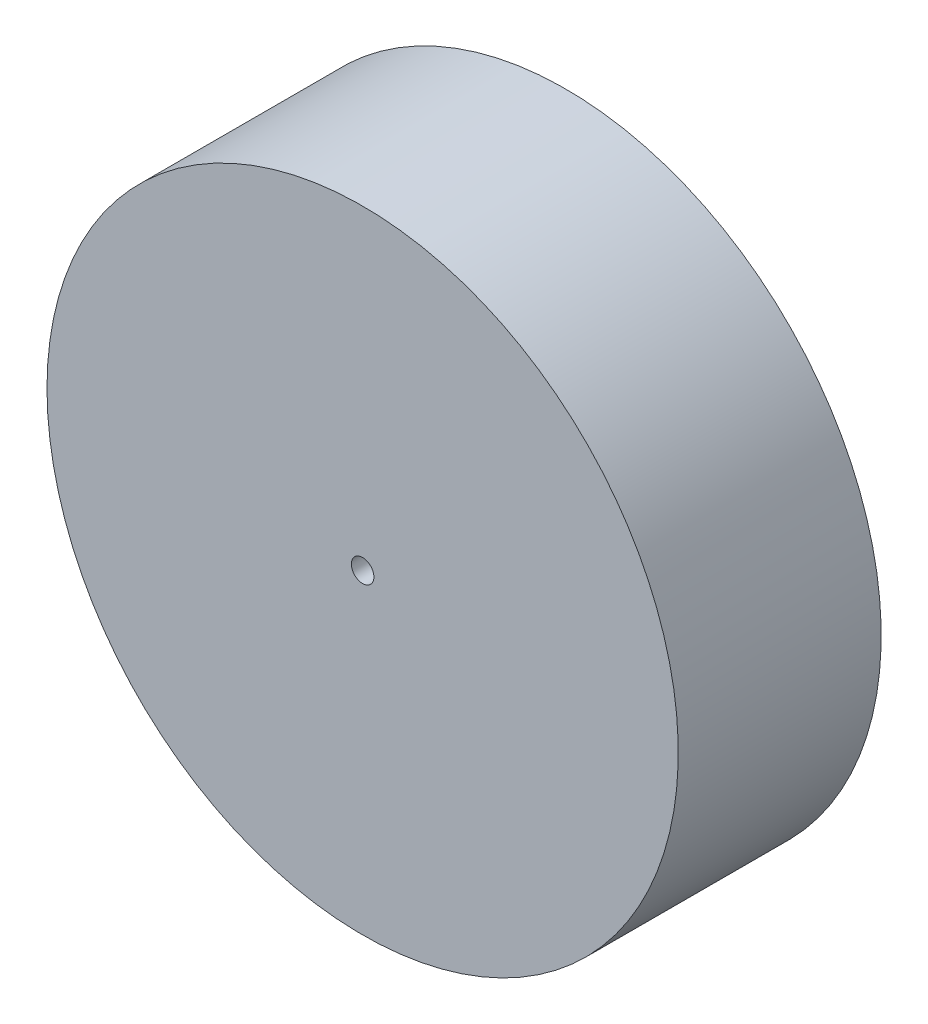
ISO-10303-21;
HEADER;
FILE_DESCRIPTION(('STEP AP214'),'2;1');
FILE_NAME('part.step','',(''),(''),'','','');
FILE_SCHEMA(('AUTOMOTIVE_DESIGN { 1 0 10303 214 1 1 1 1 }'));
ENDSEC;
DATA;
#1=APPLICATION_CONTEXT('core data for automotive mechanical design processes');
#2=APPLICATION_PROTOCOL_DEFINITION('international standard','automotive_design',2000,#1);
#3=PRODUCT_CONTEXT('',#1,'mechanical');
#4=PRODUCT('Part','Part','',(#3));
#5=PRODUCT_RELATED_PRODUCT_CATEGORY('part','',(#4));
#6=PRODUCT_DEFINITION_FORMATION('','',#4);
#7=PRODUCT_DEFINITION_CONTEXT('part definition',#1,'design');
#8=PRODUCT_DEFINITION('design','',#6,#7);
#9=PRODUCT_DEFINITION_SHAPE('','',#8);
#10=(LENGTH_UNIT() NAMED_UNIT(*) SI_UNIT(.MILLI.,.METRE.));
#11=(NAMED_UNIT(*) PLANE_ANGLE_UNIT() SI_UNIT($,.RADIAN.));
#12=(NAMED_UNIT(*) SI_UNIT($,.STERADIAN.) SOLID_ANGLE_UNIT());
#13=UNCERTAINTY_MEASURE_WITH_UNIT(LENGTH_MEASURE(1.E-05),#10,'distance_accuracy_value','');
#14=(GEOMETRIC_REPRESENTATION_CONTEXT(3) GLOBAL_UNCERTAINTY_ASSIGNED_CONTEXT((#13)) GLOBAL_UNIT_ASSIGNED_CONTEXT((#10,
#11,#12)) REPRESENTATION_CONTEXT('',''));
#15=CARTESIAN_POINT('',(0.,0.,0.));
#16=DIRECTION('',(0.,0.,1.));
#17=DIRECTION('',(1.,0.,0.));
#18=AXIS2_PLACEMENT_3D('',#15,#16,#17);
#19=CARTESIAN_POINT('',(0.,0.,45.));
#20=DIRECTION('',(0.,0.,-1.));
#21=DIRECTION('',(-1.,0.,0.));
#22=AXIS2_PLACEMENT_3D('',#19,#20,#21);
#23=CYLINDRICAL_SURFACE('',#22,70.);
#24=CARTESIAN_POINT('',(0.,0.,45.));
#25=DIRECTION('',(0.,0.,1.));
#26=DIRECTION('',(1.,0.,0.));
#27=AXIS2_PLACEMENT_3D('',#24,#25,#26);
#28=CIRCLE('',#27,70.);
#29=CARTESIAN_POINT('',(-70.,0.,45.));
#30=VERTEX_POINT('',#29);
#31=EDGE_CURVE('E10',#30,#30,#28,.T.);
#32=CARTESIAN_POINT('',(0.,0.,0.));
#33=DIRECTION('',(0.,0.,1.));
#34=DIRECTION('',(1.,0.,0.));
#35=AXIS2_PLACEMENT_3D('',#32,#33,#34);
#36=CIRCLE('',#35,70.);
#37=CARTESIAN_POINT('',(-70.,0.,0.));
#38=VERTEX_POINT('',#37);
#39=EDGE_CURVE('E44',#38,#38,#36,.T.);
#40=CARTESIAN_POINT('',(-70.,0.,45.));
#41=CARTESIAN_POINT('',(-70.,0.,44.53125));
#42=CARTESIAN_POINT('',(-70.,0.,44.0625));
#43=CARTESIAN_POINT('',(-70.,0.,43.125));
#44=CARTESIAN_POINT('',(-70.,0.,42.65625));
#45=CARTESIAN_POINT('',(-70.,0.,41.71875));
#46=CARTESIAN_POINT('',(-70.,0.,41.25));
#47=CARTESIAN_POINT('',(-70.,0.,40.3125));
#48=CARTESIAN_POINT('',(-70.,0.,39.84375));
#49=CARTESIAN_POINT('',(-70.,0.,38.90625));
#50=CARTESIAN_POINT('',(-70.,0.,38.4375));
#51=CARTESIAN_POINT('',(-70.,0.,37.5));
#52=CARTESIAN_POINT('',(-70.,0.,37.03125));
#53=CARTESIAN_POINT('',(-70.,0.,36.09375));
#54=CARTESIAN_POINT('',(-70.,0.,35.625));
#55=CARTESIAN_POINT('',(-70.,0.,34.6875));
#56=CARTESIAN_POINT('',(-70.,0.,34.21875));
#57=CARTESIAN_POINT('',(-70.,0.,33.28125));
#58=CARTESIAN_POINT('',(-70.,0.,32.8125));
#59=CARTESIAN_POINT('',(-70.,0.,31.875));
#60=CARTESIAN_POINT('',(-70.,0.,31.40625));
#61=CARTESIAN_POINT('',(-70.,0.,30.46875));
#62=CARTESIAN_POINT('',(-70.,0.,30.));
#63=CARTESIAN_POINT('',(-70.,0.,29.0625));
#64=CARTESIAN_POINT('',(-70.,0.,28.59375));
#65=CARTESIAN_POINT('',(-70.,0.,27.65625));
#66=CARTESIAN_POINT('',(-70.,0.,27.1875));
#67=CARTESIAN_POINT('',(-70.,0.,26.25));
#68=CARTESIAN_POINT('',(-70.,0.,25.78125));
#69=CARTESIAN_POINT('',(-70.,0.,24.84375));
#70=CARTESIAN_POINT('',(-70.,0.,24.375));
#71=CARTESIAN_POINT('',(-70.,0.,23.4375));
#72=CARTESIAN_POINT('',(-70.,0.,22.96875));
#73=CARTESIAN_POINT('',(-70.,0.,22.03125));
#74=CARTESIAN_POINT('',(-70.,0.,21.5625));
#75=CARTESIAN_POINT('',(-70.,0.,20.625));
#76=CARTESIAN_POINT('',(-70.,0.,20.15625));
#77=CARTESIAN_POINT('',(-70.,0.,19.21875));
#78=CARTESIAN_POINT('',(-70.,0.,18.75));
#79=CARTESIAN_POINT('',(-70.,0.,17.8125));
#80=CARTESIAN_POINT('',(-70.,0.,17.34375));
#81=CARTESIAN_POINT('',(-70.,0.,16.40625));
#82=CARTESIAN_POINT('',(-70.,0.,15.9375));
#83=CARTESIAN_POINT('',(-70.,0.,15.));
#84=CARTESIAN_POINT('',(-70.,0.,14.53125));
#85=CARTESIAN_POINT('',(-70.,0.,13.59375));
#86=CARTESIAN_POINT('',(-70.,0.,13.125));
#87=CARTESIAN_POINT('',(-70.,0.,12.1875));
#88=CARTESIAN_POINT('',(-70.,0.,11.71875));
#89=CARTESIAN_POINT('',(-70.,0.,10.78125));
#90=CARTESIAN_POINT('',(-70.,0.,10.3125));
#91=CARTESIAN_POINT('',(-70.,0.,9.37499999999999));
#92=CARTESIAN_POINT('',(-70.,0.,8.90624999999999));
#93=CARTESIAN_POINT('',(-70.,0.,7.96874999999999));
#94=CARTESIAN_POINT('',(-70.,0.,7.5));
#95=CARTESIAN_POINT('',(-70.,0.,6.56249999999999));
#96=CARTESIAN_POINT('',(-70.,0.,6.09374999999999));
#97=CARTESIAN_POINT('',(-70.,0.,5.15624999999999));
#98=CARTESIAN_POINT('',(-70.,0.,4.68749999999999));
#99=CARTESIAN_POINT('',(-70.,0.,3.74999999999999));
#100=CARTESIAN_POINT('',(-70.,0.,3.28124999999999));
#101=CARTESIAN_POINT('',(-70.,0.,2.34374999999999));
#102=CARTESIAN_POINT('',(-70.,0.,1.87499999999999));
#103=CARTESIAN_POINT('',(-70.,0.,0.937499999999992));
#104=CARTESIAN_POINT('',(-70.,0.,0.468749999999993));
#105=CARTESIAN_POINT('',(-70.,0.,0.));
#106=B_SPLINE_CURVE_WITH_KNOTS('',3,(#40,#41,#42,#43,#44,#45,#46,#47,#48,#49,#50,#51,#52,#53,
#54,#55,#56,#57,#58,#59,#60,#61,#62,#63,#64,#65,#66,#67,#68,#69,#70,#71,#72,#73,#74,#75,#76,#77,
#78,#79,#80,#81,#82,#83,#84,#85,#86,#87,#88,#89,#90,#91,#92,#93,#94,#95,#96,#97,#98,#99,#100,
#101,#102,#103,#104,#105),.UNSPECIFIED.,.F.,.F.,(4,2,2,2,2,2,2,2,2,2,2,2,2,2,2,2,2,2,2,2,2,2,2,
2,2,2,2,2,2,2,2,2,4),(0.,1.40625,2.8125,4.21874999999999,5.625,7.03125,8.43749999999999,9.84375,
11.25,12.65625,14.0625,15.46875,16.875,18.28125,19.6875,21.09375,22.5,23.90625,25.3125,26.71875,
28.125,29.53125,30.9375,32.34375,33.75,35.15625,36.5625,37.96875,39.375,40.78125,42.1875,
43.59375,45.),.UNSPECIFIED.);
#107=EDGE_CURVE('BSEAM41',#30,#38,#106,.T.);
#108=ORIENTED_EDGE('',*,*,#31,.F.);
#109=ORIENTED_EDGE('',*,*,#39,.T.);
#110=ORIENTED_EDGE('',*,*,#107,.T.);
#111=ORIENTED_EDGE('',*,*,#107,.F.);
#112=EDGE_LOOP('',(#108,#110,#109,#111));
#113=FACE_BOUND('',#112,.T.);
#114=ADVANCED_FACE('F41',(#113),#23,.T.);
#115=CARTESIAN_POINT('',(0.,0.,45.));
#116=DIRECTION('',(0.,0.,1.));
#117=DIRECTION('',(1.,0.,0.));
#118=AXIS2_PLACEMENT_3D('',#115,#116,#117);
#119=PLANE('',#118);
#120=CARTESIAN_POINT('',(0.,0.,45.));
#121=DIRECTION('',(0.,0.,1.));
#122=DIRECTION('',(1.,0.,0.));
#123=AXIS2_PLACEMENT_3D('',#120,#121,#122);
#124=CIRCLE('',#123,2.5);
#125=CARTESIAN_POINT('',(2.5,0.,45.));
#126=VERTEX_POINT('',#125);
#127=EDGE_CURVE('E55',#126,#126,#124,.T.);
#128=ORIENTED_EDGE('',*,*,#127,.F.);
#129=EDGE_LOOP('',(#128));
#130=FACE_BOUND('',#129,.T.);
#131=ORIENTED_EDGE('',*,*,#31,.T.);
#132=EDGE_LOOP('',(#131));
#133=FACE_BOUND('',#132,.T.);
#134=ADVANCED_FACE('F72',(#130,#133),#119,.T.);
#135=CARTESIAN_POINT('',(0.,0.,0.));
#136=DIRECTION('',(0.,0.,1.));
#137=DIRECTION('',(1.,0.,0.));
#138=AXIS2_PLACEMENT_3D('',#135,#136,#137);
#139=PLANE('',#138);
#140=ORIENTED_EDGE('',*,*,#39,.F.);
#141=EDGE_LOOP('',(#140));
#142=FACE_BOUND('',#141,.T.);
#143=ADVANCED_FACE('F68',(#142),#139,.F.);
#144=CARTESIAN_POINT('',(0.,0.,25.));
#145=DIRECTION('',(0.,0.,1.));
#146=DIRECTION('',(1.,0.,0.));
#147=AXIS2_PLACEMENT_3D('',#144,#145,#146);
#148=CYLINDRICAL_SURFACE('',#147,2.5);
#149=CARTESIAN_POINT('',(0.,0.,25.));
#150=DIRECTION('',(0.,0.,1.));
#151=DIRECTION('',(1.,0.,0.));
#152=AXIS2_PLACEMENT_3D('',#149,#150,#151);
#153=CIRCLE('',#152,2.5);
#154=CARTESIAN_POINT('',(2.5,0.,25.));
#155=VERTEX_POINT('',#154);
#156=EDGE_CURVE('E53',#155,#155,#153,.T.);
#157=ORIENTED_EDGE('',*,*,#156,.F.);
#158=EDGE_LOOP('',(#157));
#159=FACE_BOUND('',#158,.T.);
#160=ORIENTED_EDGE('',*,*,#127,.T.);
#161=EDGE_LOOP('',(#160));
#162=FACE_BOUND('',#161,.T.);
#163=ADVANCED_FACE('F65',(#159,#162),#148,.F.);
#164=CARTESIAN_POINT('',(0.,0.,25.));
#165=DIRECTION('',(0.,0.,1.));
#166=DIRECTION('',(1.,0.,0.));
#167=AXIS2_PLACEMENT_3D('',#164,#165,#166);
#168=PLANE('',#167);
#169=ORIENTED_EDGE('',*,*,#156,.T.);
#170=EDGE_LOOP('',(#169));
#171=FACE_BOUND('',#170,.T.);
#172=ADVANCED_FACE('F63',(#171),#168,.T.);
#173=CLOSED_SHELL('',(#114,#134,#143,#163,#172));
#174=MANIFOLD_SOLID_BREP('B2',#173);
#175=ADVANCED_BREP_SHAPE_REPRESENTATION('',(#18,#174),#14);
#176=SHAPE_DEFINITION_REPRESENTATION(#9,#175);
ENDSEC;
END-ISO-10303-21;
